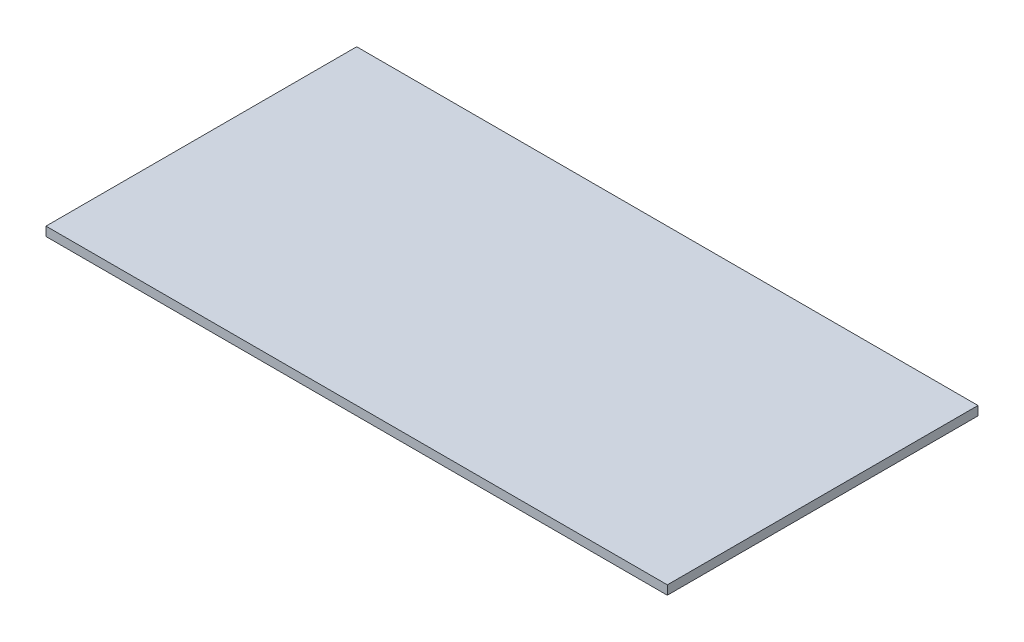
ISO-10303-21;
HEADER;
FILE_DESCRIPTION(('STEP AP214'),'2;1');
FILE_NAME('part.step','',(''),(''),'','','');
FILE_SCHEMA(('AUTOMOTIVE_DESIGN { 1 0 10303 214 1 1 1 1 }'));
ENDSEC;
DATA;
#1=APPLICATION_CONTEXT('core data for automotive mechanical design processes');
#2=APPLICATION_PROTOCOL_DEFINITION('international standard','automotive_design',2000,#1);
#3=PRODUCT_CONTEXT('',#1,'mechanical');
#4=PRODUCT('Part','Part','',(#3));
#5=PRODUCT_RELATED_PRODUCT_CATEGORY('part','',(#4));
#6=PRODUCT_DEFINITION_FORMATION('','',#4);
#7=PRODUCT_DEFINITION_CONTEXT('part definition',#1,'design');
#8=PRODUCT_DEFINITION('design','',#6,#7);
#9=PRODUCT_DEFINITION_SHAPE('','',#8);
#10=(LENGTH_UNIT() NAMED_UNIT(*) SI_UNIT(.MILLI.,.METRE.));
#11=(NAMED_UNIT(*) PLANE_ANGLE_UNIT() SI_UNIT($,.RADIAN.));
#12=(NAMED_UNIT(*) SI_UNIT($,.STERADIAN.) SOLID_ANGLE_UNIT());
#13=UNCERTAINTY_MEASURE_WITH_UNIT(LENGTH_MEASURE(1.E-05),#10,'distance_accuracy_value','');
#14=(GEOMETRIC_REPRESENTATION_CONTEXT(3) GLOBAL_UNCERTAINTY_ASSIGNED_CONTEXT((#13)) GLOBAL_UNIT_ASSIGNED_CONTEXT((#10,
#11,#12)) REPRESENTATION_CONTEXT('',''));
#15=CARTESIAN_POINT('',(0.,0.,0.));
#16=DIRECTION('',(0.,0.,1.));
#17=DIRECTION('',(1.,0.,0.));
#18=AXIS2_PLACEMENT_3D('',#15,#16,#17);
#19=CARTESIAN_POINT('',(0.,1.6,0.));
#20=DIRECTION('',(1.,0.,0.));
#21=DIRECTION('',(0.,0.,-1.));
#22=AXIS2_PLACEMENT_3D('',#19,#20,#21);
#23=PLANE('',#22);
#24=DIRECTION('',(0.,0.,1.));
#25=VECTOR('',#24,1.);
#26=CARTESIAN_POINT('',(0.,0.,0.));
#27=LINE('',#26,#25);
#28=CARTESIAN_POINT('',(0.,0.,-55.));
#29=VERTEX_POINT('',#28);
#30=CARTESIAN_POINT('',(0.,0.,0.));
#31=VERTEX_POINT('',#30);
#32=EDGE_CURVE('E95',#29,#31,#27,.T.);
#33=ORIENTED_EDGE('',*,*,#32,.T.);
#34=DIRECTION('',(0.,-1.,0.));
#35=VECTOR('',#34,1.);
#36=CARTESIAN_POINT('',(0.,1.6,0.));
#37=LINE('',#36,#35);
#38=CARTESIAN_POINT('',(0.,1.6,0.));
#39=VERTEX_POINT('',#38);
#40=EDGE_CURVE('E11',#39,#31,#37,.T.);
#41=ORIENTED_EDGE('',*,*,#40,.F.);
#42=DIRECTION('',(0.,0.,1.));
#43=VECTOR('',#42,1.);
#44=CARTESIAN_POINT('',(0.,1.6,0.));
#45=LINE('',#44,#43);
#46=CARTESIAN_POINT('',(0.,1.6,-55.));
#47=VERTEX_POINT('',#46);
#48=EDGE_CURVE('E83',#47,#39,#45,.T.);
#49=ORIENTED_EDGE('',*,*,#48,.F.);
#50=DIRECTION('',(0.,-1.,0.));
#51=VECTOR('',#50,1.);
#52=CARTESIAN_POINT('',(0.,1.6,-55.));
#53=LINE('',#52,#51);
#54=EDGE_CURVE('E91',#47,#29,#53,.T.);
#55=ORIENTED_EDGE('',*,*,#54,.T.);
#56=EDGE_LOOP('',(#33,#41,#49,#55));
#57=FACE_BOUND('',#56,.T.);
#58=ADVANCED_FACE('F32',(#57),#23,.F.);
#59=CARTESIAN_POINT('',(0.,1.6,0.));
#60=DIRECTION('',(0.,0.,-1.));
#61=DIRECTION('',(-1.,0.,0.));
#62=AXIS2_PLACEMENT_3D('',#59,#60,#61);
#63=PLANE('',#62);
#64=DIRECTION('',(1.,0.,0.));
#65=VECTOR('',#64,1.);
#66=CARTESIAN_POINT('',(0.,0.,0.));
#67=LINE('',#66,#65);
#68=CARTESIAN_POINT('',(110.,0.,0.));
#69=VERTEX_POINT('',#68);
#70=EDGE_CURVE('E87',#31,#69,#67,.T.);
#71=ORIENTED_EDGE('',*,*,#70,.T.);
#72=DIRECTION('',(0.,-1.,0.));
#73=VECTOR('',#72,1.);
#74=CARTESIAN_POINT('',(110.,1.6,0.));
#75=LINE('',#74,#73);
#76=CARTESIAN_POINT('',(110.,1.6,0.));
#77=VERTEX_POINT('',#76);
#78=EDGE_CURVE('E40',#77,#69,#75,.T.);
#79=ORIENTED_EDGE('',*,*,#78,.F.);
#80=DIRECTION('',(1.,0.,0.));
#81=VECTOR('',#80,1.);
#82=CARTESIAN_POINT('',(0.,1.6,0.));
#83=LINE('',#82,#81);
#84=EDGE_CURVE('E78',#39,#77,#83,.T.);
#85=ORIENTED_EDGE('',*,*,#84,.F.);
#86=ORIENTED_EDGE('',*,*,#40,.T.);
#87=EDGE_LOOP('',(#71,#79,#85,#86));
#88=FACE_BOUND('',#87,.T.);
#89=ADVANCED_FACE('F86',(#88),#63,.F.);
#90=CARTESIAN_POINT('',(110.,1.6,0.));
#91=DIRECTION('',(-1.,0.,0.));
#92=DIRECTION('',(0.,0.,1.));
#93=AXIS2_PLACEMENT_3D('',#90,#91,#92);
#94=PLANE('',#93);
#95=DIRECTION('',(0.,0.,-1.));
#96=VECTOR('',#95,1.);
#97=CARTESIAN_POINT('',(110.,0.,0.));
#98=LINE('',#97,#96);
#99=CARTESIAN_POINT('',(110.,0.,-55.));
#100=VERTEX_POINT('',#99);
#101=EDGE_CURVE('E65',#69,#100,#98,.T.);
#102=ORIENTED_EDGE('',*,*,#101,.T.);
#103=DIRECTION('',(0.,-1.,0.));
#104=VECTOR('',#103,1.);
#105=CARTESIAN_POINT('',(110.,1.6,-55.));
#106=LINE('',#105,#104);
#107=CARTESIAN_POINT('',(110.,1.6,-55.));
#108=VERTEX_POINT('',#107);
#109=EDGE_CURVE('E88',#108,#100,#106,.T.);
#110=ORIENTED_EDGE('',*,*,#109,.F.);
#111=DIRECTION('',(0.,0.,-1.));
#112=VECTOR('',#111,1.);
#113=CARTESIAN_POINT('',(110.,1.6,0.));
#114=LINE('',#113,#112);
#115=EDGE_CURVE('E81',#77,#108,#114,.T.);
#116=ORIENTED_EDGE('',*,*,#115,.F.);
#117=ORIENTED_EDGE('',*,*,#78,.T.);
#118=EDGE_LOOP('',(#102,#110,#116,#117));
#119=FACE_BOUND('',#118,.T.);
#120=ADVANCED_FACE('F89',(#119),#94,.F.);
#121=CARTESIAN_POINT('',(0.,1.6,-55.));
#122=DIRECTION('',(0.,0.,1.));
#123=DIRECTION('',(1.,0.,0.));
#124=AXIS2_PLACEMENT_3D('',#121,#122,#123);
#125=PLANE('',#124);
#126=DIRECTION('',(-1.,0.,0.));
#127=VECTOR('',#126,1.);
#128=CARTESIAN_POINT('',(0.,0.,-55.));
#129=LINE('',#128,#127);
#130=EDGE_CURVE('E71',#100,#29,#129,.T.);
#131=ORIENTED_EDGE('',*,*,#130,.T.);
#132=ORIENTED_EDGE('',*,*,#54,.F.);
#133=DIRECTION('',(-1.,0.,0.));
#134=VECTOR('',#133,1.);
#135=CARTESIAN_POINT('',(0.,1.6,-55.));
#136=LINE('',#135,#134);
#137=EDGE_CURVE('E48',#108,#47,#136,.T.);
#138=ORIENTED_EDGE('',*,*,#137,.F.);
#139=ORIENTED_EDGE('',*,*,#109,.T.);
#140=EDGE_LOOP('',(#131,#132,#138,#139));
#141=FACE_BOUND('',#140,.T.);
#142=ADVANCED_FACE('F102',(#141),#125,.F.);
#143=CARTESIAN_POINT('',(0.,1.6,0.));
#144=DIRECTION('',(0.,-1.,0.));
#145=DIRECTION('',(0.,0.,-1.));
#146=AXIS2_PLACEMENT_3D('',#143,#144,#145);
#147=PLANE('',#146);
#148=ORIENTED_EDGE('',*,*,#48,.T.);
#149=ORIENTED_EDGE('',*,*,#84,.T.);
#150=ORIENTED_EDGE('',*,*,#115,.T.);
#151=ORIENTED_EDGE('',*,*,#137,.T.);
#152=EDGE_LOOP('',(#148,#149,#150,#151));
#153=FACE_BOUND('',#152,.T.);
#154=ADVANCED_FACE('F79',(#153),#147,.F.);
#155=CARTESIAN_POINT('',(0.,0.,0.));
#156=DIRECTION('',(0.,-1.,0.));
#157=DIRECTION('',(0.,0.,-1.));
#158=AXIS2_PLACEMENT_3D('',#155,#156,#157);
#159=PLANE('',#158);
#160=ORIENTED_EDGE('',*,*,#32,.F.);
#161=ORIENTED_EDGE('',*,*,#130,.F.);
#162=ORIENTED_EDGE('',*,*,#101,.F.);
#163=ORIENTED_EDGE('',*,*,#70,.F.);
#164=EDGE_LOOP('',(#160,#161,#162,#163));
#165=FACE_BOUND('',#164,.T.);
#166=ADVANCED_FACE('F105',(#165),#159,.T.);
#167=CLOSED_SHELL('',(#58,#89,#120,#142,#154,#166));
#168=MANIFOLD_SOLID_BREP('B2',#167);
#169=ADVANCED_BREP_SHAPE_REPRESENTATION('',(#18,#168),#14);
#170=SHAPE_DEFINITION_REPRESENTATION(#9,#169);
ENDSEC;
END-ISO-10303-21;
